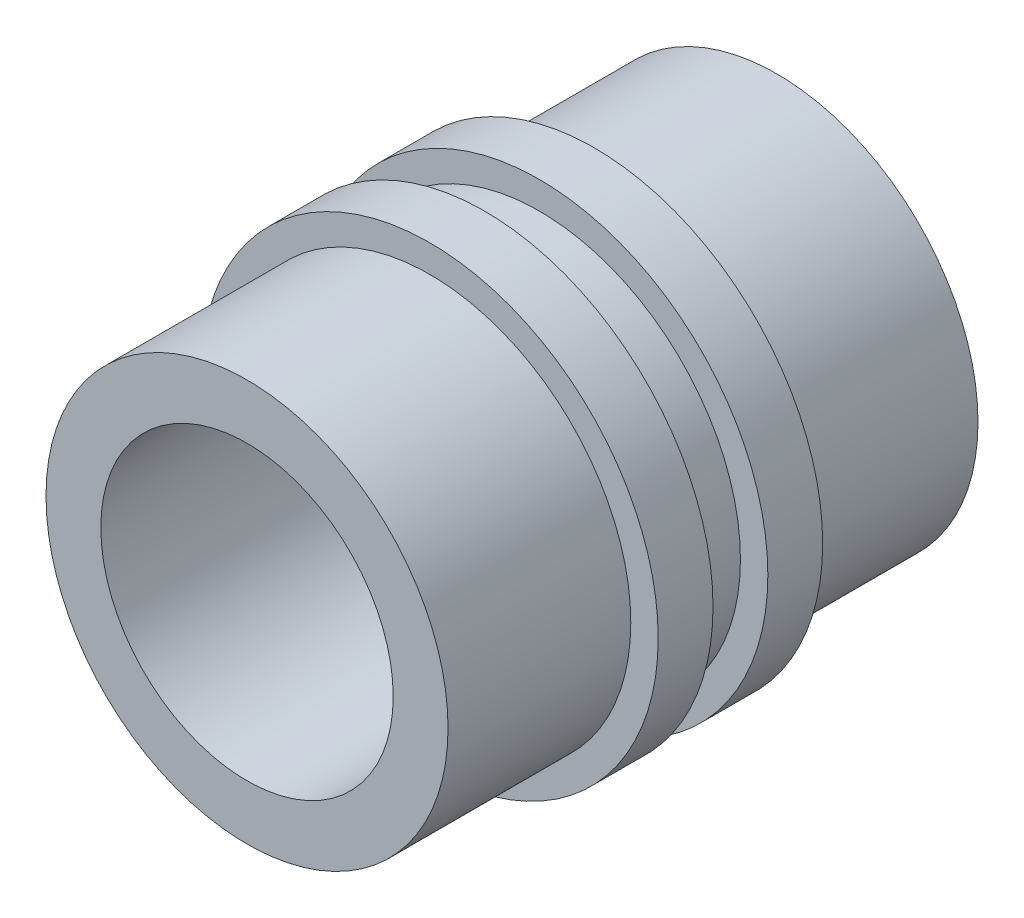
ISO-10303-21;
HEADER;
FILE_DESCRIPTION(('STEP AP214'),'2;1');
FILE_NAME('part.step','',(''),(''),'','','');
FILE_SCHEMA(('AUTOMOTIVE_DESIGN { 1 0 10303 214 1 1 1 1 }'));
ENDSEC;
DATA;
#1=APPLICATION_CONTEXT('core data for automotive mechanical design processes');
#2=APPLICATION_PROTOCOL_DEFINITION('international standard','automotive_design',2000,#1);
#3=PRODUCT_CONTEXT('',#1,'mechanical');
#4=PRODUCT('Part','Part','',(#3));
#5=PRODUCT_RELATED_PRODUCT_CATEGORY('part','',(#4));
#6=PRODUCT_DEFINITION_FORMATION('','',#4);
#7=PRODUCT_DEFINITION_CONTEXT('part definition',#1,'design');
#8=PRODUCT_DEFINITION('design','',#6,#7);
#9=PRODUCT_DEFINITION_SHAPE('','',#8);
#10=(LENGTH_UNIT() NAMED_UNIT(*) SI_UNIT(.MILLI.,.METRE.));
#11=(NAMED_UNIT(*) PLANE_ANGLE_UNIT() SI_UNIT($,.RADIAN.));
#12=(NAMED_UNIT(*) SI_UNIT($,.STERADIAN.) SOLID_ANGLE_UNIT());
#13=UNCERTAINTY_MEASURE_WITH_UNIT(LENGTH_MEASURE(1.E-05),#10,'distance_accuracy_value','');
#14=(GEOMETRIC_REPRESENTATION_CONTEXT(3) GLOBAL_UNCERTAINTY_ASSIGNED_CONTEXT((#13)) GLOBAL_UNIT_ASSIGNED_CONTEXT((#10,
#11,#12)) REPRESENTATION_CONTEXT('',''));
#15=CARTESIAN_POINT('',(0.,0.,0.));
#16=DIRECTION('',(0.,0.,1.));
#17=DIRECTION('',(1.,0.,0.));
#18=AXIS2_PLACEMENT_3D('',#15,#16,#17);
#19=CARTESIAN_POINT('',(0.,0.,-3.6));
#20=DIRECTION('',(0.,0.,1.));
#21=DIRECTION('',(1.,0.,0.));
#22=AXIS2_PLACEMENT_3D('',#19,#20,#21);
#23=CYLINDRICAL_SURFACE('',#22,15.);
#24=CARTESIAN_POINT('',(0.,0.,-3.6));
#25=DIRECTION('',(0.,0.,1.));
#26=DIRECTION('',(1.,0.,0.));
#27=AXIS2_PLACEMENT_3D('',#24,#25,#26);
#28=CIRCLE('',#27,15.);
#29=CARTESIAN_POINT('',(15.,0.,-3.6));
#30=VERTEX_POINT('',#29);
#31=EDGE_CURVE('E62',#30,#30,#28,.T.);
#32=ORIENTED_EDGE('',*,*,#31,.T.);
#33=EDGE_LOOP('',(#32));
#34=FACE_BOUND('',#33,.T.);
#35=CARTESIAN_POINT('',(0.,0.,0.));
#36=DIRECTION('',(0.,0.,1.));
#37=DIRECTION('',(1.,0.,0.));
#38=AXIS2_PLACEMENT_3D('',#35,#36,#37);
#39=CIRCLE('',#38,15.);
#40=CARTESIAN_POINT('',(15.,0.,0.));
#41=VERTEX_POINT('',#40);
#42=EDGE_CURVE('E34',#41,#41,#39,.T.);
#43=ORIENTED_EDGE('',*,*,#42,.F.);
#44=EDGE_LOOP('',(#43));
#45=FACE_BOUND('',#44,.T.);
#46=ADVANCED_FACE('F31',(#34,#45),#23,.T.);
#47=CARTESIAN_POINT('',(0.,0.,-3.6));
#48=DIRECTION('',(0.,0.,1.));
#49=DIRECTION('',(1.,0.,0.));
#50=AXIS2_PLACEMENT_3D('',#47,#48,#49);
#51=PLANE('',#50);
#52=CARTESIAN_POINT('',(0.,0.,-3.6));
#53=DIRECTION('',(0.,0.,-1.));
#54=DIRECTION('',(-1.,0.,0.));
#55=AXIS2_PLACEMENT_3D('',#52,#53,#54);
#56=CIRCLE('',#55,13.2);
#57=CARTESIAN_POINT('',(-13.2,0.,-3.6));
#58=VERTEX_POINT('',#57);
#59=EDGE_CURVE('E43',#58,#58,#56,.T.);
#60=ORIENTED_EDGE('',*,*,#59,.F.);
#61=EDGE_LOOP('',(#60));
#62=FACE_BOUND('',#61,.T.);
#63=ORIENTED_EDGE('',*,*,#31,.F.);
#64=EDGE_LOOP('',(#63));
#65=FACE_BOUND('',#64,.T.);
#66=ADVANCED_FACE('F72',(#62,#65),#51,.F.);
#67=CARTESIAN_POINT('',(0.,0.,0.));
#68=DIRECTION('',(0.,0.,1.));
#69=DIRECTION('',(1.,0.,0.));
#70=AXIS2_PLACEMENT_3D('',#67,#68,#69);
#71=PLANE('',#70);
#72=CARTESIAN_POINT('',(0.,0.,0.));
#73=DIRECTION('',(0.,0.,1.));
#74=DIRECTION('',(1.,0.,0.));
#75=AXIS2_PLACEMENT_3D('',#72,#73,#74);
#76=CIRCLE('',#75,13.2);
#77=CARTESIAN_POINT('',(13.2,0.,0.));
#78=VERTEX_POINT('',#77);
#79=EDGE_CURVE('E38',#78,#78,#76,.T.);
#80=ORIENTED_EDGE('',*,*,#79,.F.);
#81=EDGE_LOOP('',(#80));
#82=FACE_BOUND('',#81,.T.);
#83=ORIENTED_EDGE('',*,*,#42,.T.);
#84=EDGE_LOOP('',(#83));
#85=FACE_BOUND('',#84,.T.);
#86=ADVANCED_FACE('F69',(#82,#85),#71,.T.);
#87=CARTESIAN_POINT('',(0.,0.,-15.6));
#88=DIRECTION('',(0.,0.,1.));
#89=DIRECTION('',(1.,0.,0.));
#90=AXIS2_PLACEMENT_3D('',#87,#88,#89);
#91=CYLINDRICAL_SURFACE('',#90,13.2);
#92=CARTESIAN_POINT('',(0.,0.,-15.6));
#93=DIRECTION('',(0.,0.,-1.));
#94=DIRECTION('',(-1.,0.,0.));
#95=AXIS2_PLACEMENT_3D('',#92,#93,#94);
#96=CIRCLE('',#95,13.2);
#97=CARTESIAN_POINT('',(-13.2,0.,-15.6));
#98=VERTEX_POINT('',#97);
#99=EDGE_CURVE('E57',#98,#98,#96,.T.);
#100=ORIENTED_EDGE('',*,*,#99,.F.);
#101=EDGE_LOOP('',(#100));
#102=FACE_BOUND('',#101,.T.);
#103=ORIENTED_EDGE('',*,*,#59,.T.);
#104=EDGE_LOOP('',(#103));
#105=FACE_BOUND('',#104,.T.);
#106=ADVANCED_FACE('F81',(#102,#105),#91,.T.);
#107=CARTESIAN_POINT('',(0.,0.,-15.6));
#108=DIRECTION('',(0.,0.,-1.));
#109=DIRECTION('',(-1.,0.,0.));
#110=AXIS2_PLACEMENT_3D('',#107,#108,#109);
#111=PLANE('',#110);
#112=CARTESIAN_POINT('',(0.,0.,-15.6));
#113=DIRECTION('',(0.,0.,-1.));
#114=DIRECTION('',(-1.,0.,0.));
#115=AXIS2_PLACEMENT_3D('',#112,#113,#114);
#116=CIRCLE('',#115,9.6);
#117=CARTESIAN_POINT('',(-9.6,0.,-15.6));
#118=VERTEX_POINT('',#117);
#119=EDGE_CURVE('E125',#118,#118,#116,.T.);
#120=ORIENTED_EDGE('',*,*,#119,.F.);
#121=EDGE_LOOP('',(#120));
#122=FACE_BOUND('',#121,.T.);
#123=ORIENTED_EDGE('',*,*,#99,.T.);
#124=EDGE_LOOP('',(#123));
#125=FACE_BOUND('',#124,.T.);
#126=ADVANCED_FACE('F88',(#122,#125),#111,.T.);
#127=CARTESIAN_POINT('',(0.,0.,3.6));
#128=DIRECTION('',(0.,0.,-1.));
#129=DIRECTION('',(-1.,0.,0.));
#130=AXIS2_PLACEMENT_3D('',#127,#128,#129);
#131=CYLINDRICAL_SURFACE('',#130,13.2);
#132=CARTESIAN_POINT('',(0.,0.,3.6));
#133=DIRECTION('',(0.,0.,1.));
#134=DIRECTION('',(1.,0.,0.));
#135=AXIS2_PLACEMENT_3D('',#132,#133,#134);
#136=CIRCLE('',#135,13.2);
#137=CARTESIAN_POINT('',(13.2,0.,3.6));
#138=VERTEX_POINT('',#137);
#139=EDGE_CURVE('E52',#138,#138,#136,.T.);
#140=ORIENTED_EDGE('',*,*,#139,.F.);
#141=EDGE_LOOP('',(#140));
#142=FACE_BOUND('',#141,.T.);
#143=ORIENTED_EDGE('',*,*,#79,.T.);
#144=EDGE_LOOP('',(#143));
#145=FACE_BOUND('',#144,.T.);
#146=ADVANCED_FACE('F92',(#142,#145),#131,.T.);
#147=CARTESIAN_POINT('',(0.,0.,7.2));
#148=DIRECTION('',(0.,0.,-1.));
#149=DIRECTION('',(-1.,0.,0.));
#150=AXIS2_PLACEMENT_3D('',#147,#148,#149);
#151=CYLINDRICAL_SURFACE('',#150,15.);
#152=CARTESIAN_POINT('',(0.,0.,7.2));
#153=DIRECTION('',(0.,0.,1.));
#154=DIRECTION('',(1.,0.,0.));
#155=AXIS2_PLACEMENT_3D('',#152,#153,#154);
#156=CIRCLE('',#155,15.);
#157=CARTESIAN_POINT('',(15.,0.,7.2));
#158=VERTEX_POINT('',#157);
#159=EDGE_CURVE('E49',#158,#158,#156,.T.);
#160=ORIENTED_EDGE('',*,*,#159,.F.);
#161=EDGE_LOOP('',(#160));
#162=FACE_BOUND('',#161,.T.);
#163=CARTESIAN_POINT('',(0.,0.,3.6));
#164=DIRECTION('',(0.,0.,1.));
#165=DIRECTION('',(1.,0.,0.));
#166=AXIS2_PLACEMENT_3D('',#163,#164,#165);
#167=CIRCLE('',#166,15.);
#168=CARTESIAN_POINT('',(15.,0.,3.6));
#169=VERTEX_POINT('',#168);
#170=EDGE_CURVE('E53',#169,#169,#167,.T.);
#171=ORIENTED_EDGE('',*,*,#170,.T.);
#172=EDGE_LOOP('',(#171));
#173=FACE_BOUND('',#172,.T.);
#174=ADVANCED_FACE('F96',(#162,#173),#151,.T.);
#175=CARTESIAN_POINT('',(0.,0.,7.2));
#176=DIRECTION('',(0.,0.,1.));
#177=DIRECTION('',(1.,0.,0.));
#178=AXIS2_PLACEMENT_3D('',#175,#176,#177);
#179=PLANE('',#178);
#180=CARTESIAN_POINT('',(0.,0.,7.2));
#181=DIRECTION('',(0.,0.,1.));
#182=DIRECTION('',(1.,0.,0.));
#183=AXIS2_PLACEMENT_3D('',#180,#181,#182);
#184=CIRCLE('',#183,13.2);
#185=CARTESIAN_POINT('',(13.2,0.,7.2));
#186=VERTEX_POINT('',#185);
#187=EDGE_CURVE('E10',#186,#186,#184,.T.);
#188=ORIENTED_EDGE('',*,*,#187,.F.);
#189=EDGE_LOOP('',(#188));
#190=FACE_BOUND('',#189,.T.);
#191=ORIENTED_EDGE('',*,*,#159,.T.);
#192=EDGE_LOOP('',(#191));
#193=FACE_BOUND('',#192,.T.);
#194=ADVANCED_FACE('F100',(#190,#193),#179,.T.);
#195=CARTESIAN_POINT('',(0.,0.,3.6));
#196=DIRECTION('',(0.,0.,1.));
#197=DIRECTION('',(1.,0.,0.));
#198=AXIS2_PLACEMENT_3D('',#195,#196,#197);
#199=PLANE('',#198);
#200=ORIENTED_EDGE('',*,*,#139,.T.);
#201=EDGE_LOOP('',(#200));
#202=FACE_BOUND('',#201,.T.);
#203=ORIENTED_EDGE('',*,*,#170,.F.);
#204=EDGE_LOOP('',(#203));
#205=FACE_BOUND('',#204,.T.);
#206=ADVANCED_FACE('F102',(#202,#205),#199,.F.);
#207=CARTESIAN_POINT('',(0.,0.,19.2));
#208=DIRECTION('',(0.,0.,-1.));
#209=DIRECTION('',(-1.,0.,0.));
#210=AXIS2_PLACEMENT_3D('',#207,#208,#209);
#211=CYLINDRICAL_SURFACE('',#210,13.2);
#212=CARTESIAN_POINT('',(0.,0.,19.2));
#213=DIRECTION('',(0.,0.,1.));
#214=DIRECTION('',(1.,0.,0.));
#215=AXIS2_PLACEMENT_3D('',#212,#213,#214);
#216=CIRCLE('',#215,13.2);
#217=CARTESIAN_POINT('',(13.2,0.,19.2));
#218=VERTEX_POINT('',#217);
#219=EDGE_CURVE('E47',#218,#218,#216,.T.);
#220=ORIENTED_EDGE('',*,*,#219,.F.);
#221=EDGE_LOOP('',(#220));
#222=FACE_BOUND('',#221,.T.);
#223=ORIENTED_EDGE('',*,*,#187,.T.);
#224=EDGE_LOOP('',(#223));
#225=FACE_BOUND('',#224,.T.);
#226=ADVANCED_FACE('F105',(#222,#225),#211,.T.);
#227=CARTESIAN_POINT('',(0.,0.,19.2));
#228=DIRECTION('',(0.,0.,1.));
#229=DIRECTION('',(1.,0.,0.));
#230=AXIS2_PLACEMENT_3D('',#227,#228,#229);
#231=PLANE('',#230);
#232=CARTESIAN_POINT('',(0.,0.,19.2));
#233=DIRECTION('',(0.,0.,1.));
#234=DIRECTION('',(1.,0.,0.));
#235=AXIS2_PLACEMENT_3D('',#232,#233,#234);
#236=CIRCLE('',#235,9.6);
#237=CARTESIAN_POINT('',(9.6,0.,19.2));
#238=VERTEX_POINT('',#237);
#239=EDGE_CURVE('E128',#238,#238,#236,.T.);
#240=ORIENTED_EDGE('',*,*,#239,.F.);
#241=EDGE_LOOP('',(#240));
#242=FACE_BOUND('',#241,.T.);
#243=ORIENTED_EDGE('',*,*,#219,.T.);
#244=EDGE_LOOP('',(#243));
#245=FACE_BOUND('',#244,.T.);
#246=ADVANCED_FACE('F112',(#242,#245),#231,.T.);
#247=CARTESIAN_POINT('',(0.,0.,-103.8));
#248=DIRECTION('',(0.,0.,1.));
#249=DIRECTION('',(1.,0.,0.));
#250=AXIS2_PLACEMENT_3D('',#247,#248,#249);
#251=CYLINDRICAL_SURFACE('',#250,9.6);
#252=ORIENTED_EDGE('',*,*,#119,.T.);
#253=EDGE_LOOP('',(#252));
#254=FACE_BOUND('',#253,.T.);
#255=ORIENTED_EDGE('',*,*,#239,.T.);
#256=EDGE_LOOP('',(#255));
#257=FACE_BOUND('',#256,.T.);
#258=ADVANCED_FACE('F116',(#254,#257),#251,.F.);
#259=CLOSED_SHELL('',(#46,#66,#86,#106,#126,#146,#174,#194,#206,#226,#246,#258));
#260=MANIFOLD_SOLID_BREP('B2',#259);
#261=ADVANCED_BREP_SHAPE_REPRESENTATION('',(#18,#260),#14);
#262=SHAPE_DEFINITION_REPRESENTATION(#9,#261);
ENDSEC;
END-ISO-10303-21;
